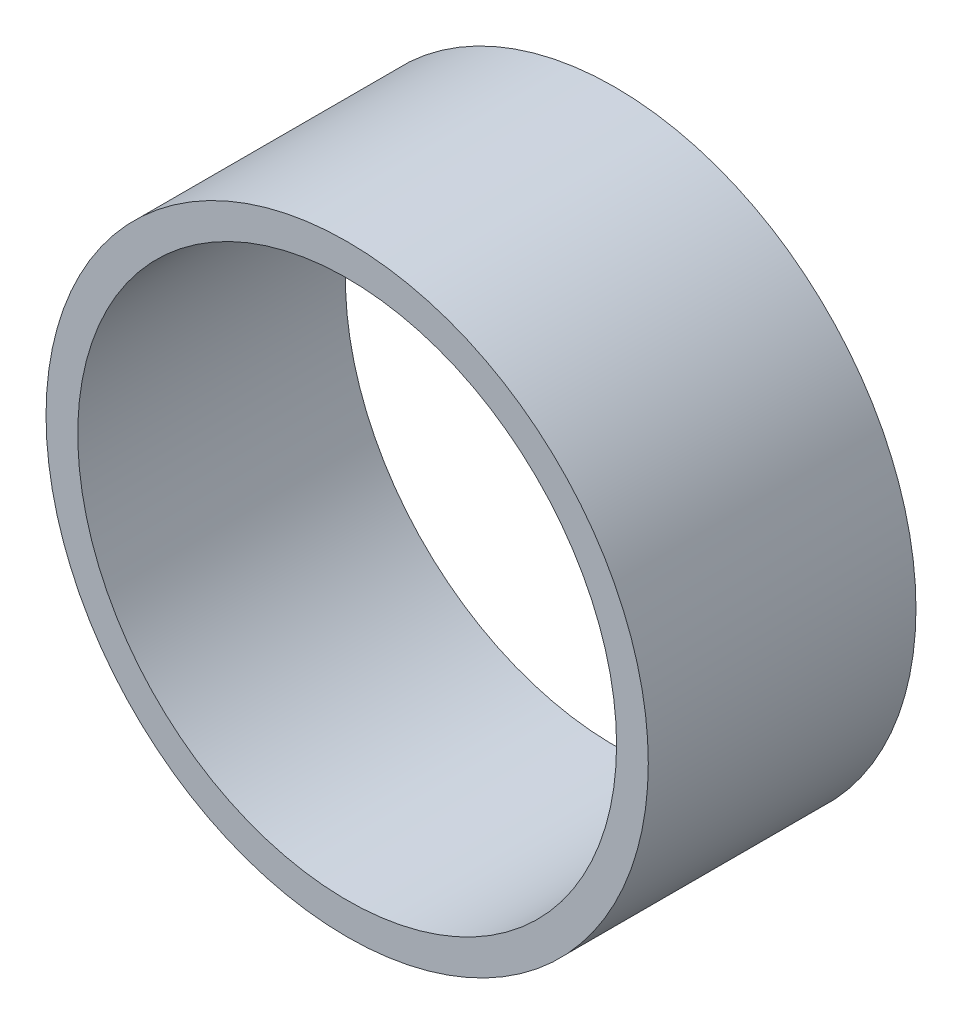
ISO-10303-21;
HEADER;
FILE_DESCRIPTION(('STEP AP214'),'2;1');
FILE_NAME('part.step','',(''),(''),'','','');
FILE_SCHEMA(('AUTOMOTIVE_DESIGN { 1 0 10303 214 1 1 1 1 }'));
ENDSEC;
DATA;
#1=APPLICATION_CONTEXT('core data for automotive mechanical design processes');
#2=APPLICATION_PROTOCOL_DEFINITION('international standard','automotive_design',2000,#1);
#3=PRODUCT_CONTEXT('',#1,'mechanical');
#4=PRODUCT('Part','Part','',(#3));
#5=PRODUCT_RELATED_PRODUCT_CATEGORY('part','',(#4));
#6=PRODUCT_DEFINITION_FORMATION('','',#4);
#7=PRODUCT_DEFINITION_CONTEXT('part definition',#1,'design');
#8=PRODUCT_DEFINITION('design','',#6,#7);
#9=PRODUCT_DEFINITION_SHAPE('','',#8);
#10=(LENGTH_UNIT() NAMED_UNIT(*) SI_UNIT(.MILLI.,.METRE.));
#11=(NAMED_UNIT(*) PLANE_ANGLE_UNIT() SI_UNIT($,.RADIAN.));
#12=(NAMED_UNIT(*) SI_UNIT($,.STERADIAN.) SOLID_ANGLE_UNIT());
#13=UNCERTAINTY_MEASURE_WITH_UNIT(LENGTH_MEASURE(1.E-05),#10,'distance_accuracy_value','');
#14=(GEOMETRIC_REPRESENTATION_CONTEXT(3) GLOBAL_UNCERTAINTY_ASSIGNED_CONTEXT((#13)) GLOBAL_UNIT_ASSIGNED_CONTEXT((#10,
#11,#12)) REPRESENTATION_CONTEXT('',''));
#15=CARTESIAN_POINT('',(0.,0.,0.));
#16=DIRECTION('',(0.,0.,1.));
#17=DIRECTION('',(1.,0.,0.));
#18=AXIS2_PLACEMENT_3D('',#15,#16,#17);
#19=CARTESIAN_POINT('',(0.,0.,50.8));
#20=DIRECTION('',(0.,0.,1.));
#21=DIRECTION('',(1.,0.,0.));
#22=AXIS2_PLACEMENT_3D('',#19,#20,#21);
#23=PLANE('',#22);
#24=CARTESIAN_POINT('',(0.,0.,50.8));
#25=DIRECTION('',(0.,0.,1.));
#26=DIRECTION('',(1.,0.,0.));
#27=AXIS2_PLACEMENT_3D('',#24,#25,#26);
#28=CIRCLE('',#27,57.15);
#29=CARTESIAN_POINT('',(57.15,0.,50.8));
#30=VERTEX_POINT('',#29);
#31=EDGE_CURVE('E10',#30,#30,#28,.T.);
#32=ORIENTED_EDGE('',*,*,#31,.T.);
#33=EDGE_LOOP('',(#32));
#34=FACE_BOUND('',#33,.T.);
#35=CARTESIAN_POINT('',(0.,0.,50.8));
#36=DIRECTION('',(0.,0.,1.));
#37=DIRECTION('',(1.,0.,0.));
#38=AXIS2_PLACEMENT_3D('',#35,#36,#37);
#39=CIRCLE('',#38,51.1302);
#40=CARTESIAN_POINT('',(51.1302,0.,50.8));
#41=VERTEX_POINT('',#40);
#42=EDGE_CURVE('E47',#41,#41,#39,.T.);
#43=ORIENTED_EDGE('',*,*,#42,.F.);
#44=EDGE_LOOP('',(#43));
#45=FACE_BOUND('',#44,.T.);
#46=ADVANCED_FACE('F36',(#34,#45),#23,.T.);
#47=CARTESIAN_POINT('',(0.,0.,0.));
#48=DIRECTION('',(0.,0.,1.));
#49=DIRECTION('',(1.,0.,0.));
#50=AXIS2_PLACEMENT_3D('',#47,#48,#49);
#51=PLANE('',#50);
#52=CARTESIAN_POINT('',(0.,0.,0.));
#53=DIRECTION('',(0.,0.,1.));
#54=DIRECTION('',(1.,0.,0.));
#55=AXIS2_PLACEMENT_3D('',#52,#53,#54);
#56=CIRCLE('',#55,57.15);
#57=CARTESIAN_POINT('',(57.15,0.,0.));
#58=VERTEX_POINT('',#57);
#59=EDGE_CURVE('E43',#58,#58,#56,.T.);
#60=ORIENTED_EDGE('',*,*,#59,.F.);
#61=EDGE_LOOP('',(#60));
#62=FACE_BOUND('',#61,.T.);
#63=CARTESIAN_POINT('',(0.,0.,0.));
#64=DIRECTION('',(0.,0.,1.));
#65=DIRECTION('',(1.,0.,0.));
#66=AXIS2_PLACEMENT_3D('',#63,#64,#65);
#67=CIRCLE('',#66,51.1302);
#68=CARTESIAN_POINT('',(51.1302,0.,0.));
#69=VERTEX_POINT('',#68);
#70=EDGE_CURVE('E51',#69,#69,#67,.T.);
#71=ORIENTED_EDGE('',*,*,#70,.T.);
#72=EDGE_LOOP('',(#71));
#73=FACE_BOUND('',#72,.T.);
#74=ADVANCED_FACE('F57',(#62,#73),#51,.F.);
#75=CARTESIAN_POINT('',(0.,0.,50.8));
#76=DIRECTION('',(0.,0.,-1.));
#77=DIRECTION('',(-1.,0.,0.));
#78=AXIS2_PLACEMENT_3D('',#75,#76,#77);
#79=CYLINDRICAL_SURFACE('',#78,57.15);
#80=ORIENTED_EDGE('',*,*,#31,.F.);
#81=EDGE_LOOP('',(#80));
#82=FACE_BOUND('',#81,.T.);
#83=ORIENTED_EDGE('',*,*,#59,.T.);
#84=EDGE_LOOP('',(#83));
#85=FACE_BOUND('',#84,.T.);
#86=ADVANCED_FACE('F38',(#82,#85),#79,.T.);
#87=CARTESIAN_POINT('',(0.,0.,50.8));
#88=DIRECTION('',(0.,0.,-1.));
#89=DIRECTION('',(-1.,0.,0.));
#90=AXIS2_PLACEMENT_3D('',#87,#88,#89);
#91=CYLINDRICAL_SURFACE('',#90,51.1302);
#92=ORIENTED_EDGE('',*,*,#42,.T.);
#93=EDGE_LOOP('',(#92));
#94=FACE_BOUND('',#93,.T.);
#95=ORIENTED_EDGE('',*,*,#70,.F.);
#96=EDGE_LOOP('',(#95));
#97=FACE_BOUND('',#96,.T.);
#98=ADVANCED_FACE('F59',(#94,#97),#91,.F.);
#99=CLOSED_SHELL('',(#46,#74,#86,#98));
#100=MANIFOLD_SOLID_BREP('B2',#99);
#101=ADVANCED_BREP_SHAPE_REPRESENTATION('',(#18,#100),#14);
#102=SHAPE_DEFINITION_REPRESENTATION(#9,#101);
ENDSEC;
END-ISO-10303-21;
